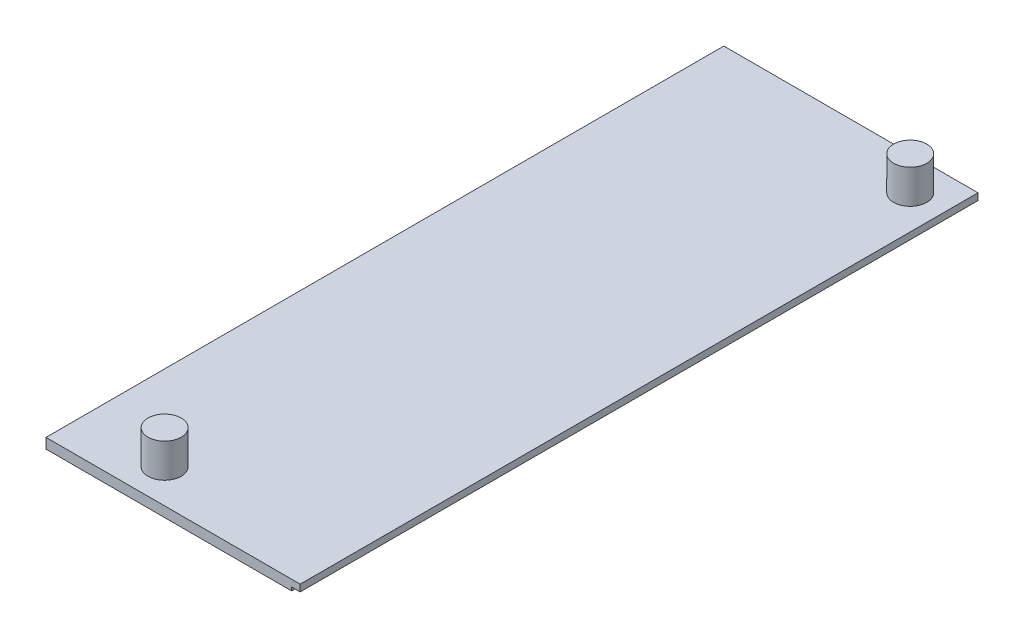
ISO-10303-21;
HEADER;
FILE_DESCRIPTION(('STEP AP214'),'2;1');
FILE_NAME('part.step','',(''),(''),'','','');
FILE_SCHEMA(('AUTOMOTIVE_DESIGN { 1 0 10303 214 1 1 1 1 }'));
ENDSEC;
DATA;
#1=APPLICATION_CONTEXT('core data for automotive mechanical design processes');
#2=APPLICATION_PROTOCOL_DEFINITION('international standard','automotive_design',2000,#1);
#3=PRODUCT_CONTEXT('',#1,'mechanical');
#4=PRODUCT('Part','Part','',(#3));
#5=PRODUCT_RELATED_PRODUCT_CATEGORY('part','',(#4));
#6=PRODUCT_DEFINITION_FORMATION('','',#4);
#7=PRODUCT_DEFINITION_CONTEXT('part definition',#1,'design');
#8=PRODUCT_DEFINITION('design','',#6,#7);
#9=PRODUCT_DEFINITION_SHAPE('','',#8);
#10=(LENGTH_UNIT() NAMED_UNIT(*) SI_UNIT(.MILLI.,.METRE.));
#11=(NAMED_UNIT(*) PLANE_ANGLE_UNIT() SI_UNIT($,.RADIAN.));
#12=(NAMED_UNIT(*) SI_UNIT($,.STERADIAN.) SOLID_ANGLE_UNIT());
#13=UNCERTAINTY_MEASURE_WITH_UNIT(LENGTH_MEASURE(1.E-05),#10,'distance_accuracy_value','');
#14=(GEOMETRIC_REPRESENTATION_CONTEXT(3) GLOBAL_UNCERTAINTY_ASSIGNED_CONTEXT((#13)) GLOBAL_UNIT_ASSIGNED_CONTEXT((#10,
#11,#12)) REPRESENTATION_CONTEXT('',''));
#15=CARTESIAN_POINT('',(0.,0.,0.));
#16=DIRECTION('',(0.,0.,1.));
#17=DIRECTION('',(1.,0.,0.));
#18=AXIS2_PLACEMENT_3D('',#15,#16,#17);
#19=CARTESIAN_POINT('',(75.,0.,200.));
#20=DIRECTION('',(-1.,0.,0.));
#21=DIRECTION('',(0.,0.,1.));
#22=AXIS2_PLACEMENT_3D('',#19,#20,#21);
#23=PLANE('',#22);
#24=DIRECTION('',(0.,0.,1.));
#25=VECTOR('',#24,1.);
#26=CARTESIAN_POINT('',(75.,1.,0.));
#27=LINE('',#26,#25);
#28=CARTESIAN_POINT('',(75.,1.,0.));
#29=VERTEX_POINT('',#28);
#30=CARTESIAN_POINT('',(75.,1.,200.));
#31=VERTEX_POINT('',#30);
#32=EDGE_CURVE('E111',#29,#31,#27,.T.);
#33=ORIENTED_EDGE('',*,*,#32,.F.);
#34=DIRECTION('',(0.,1.,0.));
#35=VECTOR('',#34,1.);
#36=CARTESIAN_POINT('',(75.,0.,0.));
#37=LINE('',#36,#35);
#38=CARTESIAN_POINT('',(75.,3.,0.));
#39=VERTEX_POINT('',#38);
#40=EDGE_CURVE('E140',#29,#39,#37,.T.);
#41=ORIENTED_EDGE('',*,*,#40,.T.);
#42=DIRECTION('',(0.,0.,-1.));
#43=VECTOR('',#42,1.);
#44=CARTESIAN_POINT('',(75.,3.,200.));
#45=LINE('',#44,#43);
#46=CARTESIAN_POINT('',(75.,3.,200.));
#47=VERTEX_POINT('',#46);
#48=EDGE_CURVE('E144',#47,#39,#45,.T.);
#49=ORIENTED_EDGE('',*,*,#48,.F.);
#50=DIRECTION('',(0.,1.,0.));
#51=VECTOR('',#50,1.);
#52=CARTESIAN_POINT('',(75.,0.,200.));
#53=LINE('',#52,#51);
#54=EDGE_CURVE('E131',#31,#47,#53,.T.);
#55=ORIENTED_EDGE('',*,*,#54,.F.);
#56=EDGE_LOOP('',(#33,#41,#49,#55));
#57=FACE_BOUND('',#56,.T.);
#58=ADVANCED_FACE('F37',(#57),#23,.F.);
#59=CARTESIAN_POINT('',(0.,0.,200.));
#60=DIRECTION('',(1.,0.,0.));
#61=DIRECTION('',(0.,0.,-1.));
#62=AXIS2_PLACEMENT_3D('',#59,#60,#61);
#63=PLANE('',#62);
#64=DIRECTION('',(0.,-1.,0.));
#65=VECTOR('',#64,1.);
#66=CARTESIAN_POINT('',(0.,0.,0.));
#67=LINE('',#66,#65);
#68=CARTESIAN_POINT('',(0.,3.,0.));
#69=VERTEX_POINT('',#68);
#70=CARTESIAN_POINT('',(0.,0.,0.));
#71=VERTEX_POINT('',#70);
#72=EDGE_CURVE('E127',#69,#71,#67,.T.);
#73=ORIENTED_EDGE('',*,*,#72,.T.);
#74=DIRECTION('',(0.,0.,-1.));
#75=VECTOR('',#74,1.);
#76=CARTESIAN_POINT('',(0.,0.,200.));
#77=LINE('',#76,#75);
#78=CARTESIAN_POINT('',(0.,0.,200.));
#79=VERTEX_POINT('',#78);
#80=EDGE_CURVE('E146',#79,#71,#77,.T.);
#81=ORIENTED_EDGE('',*,*,#80,.F.);
#82=DIRECTION('',(0.,-1.,0.));
#83=VECTOR('',#82,1.);
#84=CARTESIAN_POINT('',(0.,0.,200.));
#85=LINE('',#84,#83);
#86=CARTESIAN_POINT('',(0.,3.,200.));
#87=VERTEX_POINT('',#86);
#88=EDGE_CURVE('E128',#87,#79,#85,.T.);
#89=ORIENTED_EDGE('',*,*,#88,.F.);
#90=DIRECTION('',(0.,0.,-1.));
#91=VECTOR('',#90,1.);
#92=CARTESIAN_POINT('',(0.,3.,200.));
#93=LINE('',#92,#91);
#94=EDGE_CURVE('E134',#87,#69,#93,.T.);
#95=ORIENTED_EDGE('',*,*,#94,.T.);
#96=EDGE_LOOP('',(#73,#81,#89,#95));
#97=FACE_BOUND('',#96,.T.);
#98=ADVANCED_FACE('F39',(#97),#63,.F.);
#99=CARTESIAN_POINT('',(0.,0.,200.));
#100=DIRECTION('',(0.,1.,0.));
#101=DIRECTION('',(0.,0.,1.));
#102=AXIS2_PLACEMENT_3D('',#99,#100,#101);
#103=PLANE('',#102);
#104=DIRECTION('',(1.,0.,0.));
#105=VECTOR('',#104,1.);
#106=CARTESIAN_POINT('',(0.,0.,0.));
#107=LINE('',#106,#105);
#108=CARTESIAN_POINT('',(72.5,0.,0.));
#109=VERTEX_POINT('',#108);
#110=EDGE_CURVE('E137',#71,#109,#107,.T.);
#111=ORIENTED_EDGE('',*,*,#110,.T.);
#112=DIRECTION('',(0.,0.,-1.));
#113=VECTOR('',#112,1.);
#114=CARTESIAN_POINT('',(72.5,0.,0.));
#115=LINE('',#114,#113);
#116=CARTESIAN_POINT('',(72.5,0.,200.));
#117=VERTEX_POINT('',#116);
#118=EDGE_CURVE('E113',#117,#109,#115,.T.);
#119=ORIENTED_EDGE('',*,*,#118,.F.);
#120=DIRECTION('',(1.,0.,0.));
#121=VECTOR('',#120,1.);
#122=CARTESIAN_POINT('',(0.,0.,200.));
#123=LINE('',#122,#121);
#124=EDGE_CURVE('E85',#79,#117,#123,.T.);
#125=ORIENTED_EDGE('',*,*,#124,.F.);
#126=ORIENTED_EDGE('',*,*,#80,.T.);
#127=EDGE_LOOP('',(#111,#119,#125,#126));
#128=FACE_BOUND('',#127,.T.);
#129=ADVANCED_FACE('F154',(#128),#103,.F.);
#130=CARTESIAN_POINT('',(0.,3.,200.));
#131=DIRECTION('',(0.,-1.,0.));
#132=DIRECTION('',(0.,0.,-1.));
#133=AXIS2_PLACEMENT_3D('',#130,#131,#132);
#134=PLANE('',#133);
#135=CARTESIAN_POINT('',(64.9999999999999,3.,10.));
#136=DIRECTION('',(0.,-1.,0.));
#137=DIRECTION('',(0.,0.,-1.));
#138=AXIS2_PLACEMENT_3D('',#135,#136,#137);
#139=CIRCLE('',#138,4.9);
#140=CARTESIAN_POINT('',(64.9999999999999,3.,5.10000000000001));
#141=VERTEX_POINT('',#140);
#142=EDGE_CURVE('E11',#141,#141,#139,.F.);
#143=ORIENTED_EDGE('',*,*,#142,.F.);
#144=EDGE_LOOP('',(#143));
#145=FACE_BOUND('',#144,.T.);
#146=CARTESIAN_POINT('',(25.,3.,190.));
#147=DIRECTION('',(0.,-1.,0.));
#148=DIRECTION('',(0.,0.,-1.));
#149=AXIS2_PLACEMENT_3D('',#146,#147,#148);
#150=CIRCLE('',#149,4.89999999999999);
#151=CARTESIAN_POINT('',(25.,3.,185.1));
#152=VERTEX_POINT('',#151);
#153=EDGE_CURVE('E45',#152,#152,#150,.F.);
#154=ORIENTED_EDGE('',*,*,#153,.F.);
#155=EDGE_LOOP('',(#154));
#156=FACE_BOUND('',#155,.T.);
#157=DIRECTION('',(-1.,0.,0.));
#158=VECTOR('',#157,1.);
#159=CARTESIAN_POINT('',(0.,3.,0.));
#160=LINE('',#159,#158);
#161=EDGE_CURVE('E78',#39,#69,#160,.T.);
#162=ORIENTED_EDGE('',*,*,#161,.T.);
#163=ORIENTED_EDGE('',*,*,#94,.F.);
#164=DIRECTION('',(-1.,0.,0.));
#165=VECTOR('',#164,1.);
#166=CARTESIAN_POINT('',(0.,3.,200.));
#167=LINE('',#166,#165);
#168=EDGE_CURVE('E61',#47,#87,#167,.T.);
#169=ORIENTED_EDGE('',*,*,#168,.F.);
#170=ORIENTED_EDGE('',*,*,#48,.T.);
#171=EDGE_LOOP('',(#162,#163,#169,#170));
#172=FACE_BOUND('',#171,.T.);
#173=ADVANCED_FACE('F152',(#145,#156,#172),#134,.F.);
#174=CARTESIAN_POINT('',(0.,0.,200.));
#175=DIRECTION('',(0.,0.,-1.));
#176=DIRECTION('',(-1.,0.,0.));
#177=AXIS2_PLACEMENT_3D('',#174,#175,#176);
#178=PLANE('',#177);
#179=ORIENTED_EDGE('',*,*,#124,.T.);
#180=DIRECTION('',(0.,-1.,0.));
#181=VECTOR('',#180,1.);
#182=CARTESIAN_POINT('',(72.5,1.,200.));
#183=LINE('',#182,#181);
#184=CARTESIAN_POINT('',(72.5,1.,200.));
#185=VERTEX_POINT('',#184);
#186=EDGE_CURVE('E101',#185,#117,#183,.T.);
#187=ORIENTED_EDGE('',*,*,#186,.F.);
#188=DIRECTION('',(-1.,0.,0.));
#189=VECTOR('',#188,1.);
#190=CARTESIAN_POINT('',(0.,1.,200.));
#191=LINE('',#190,#189);
#192=EDGE_CURVE('E106',#31,#185,#191,.T.);
#193=ORIENTED_EDGE('',*,*,#192,.F.);
#194=ORIENTED_EDGE('',*,*,#54,.T.);
#195=ORIENTED_EDGE('',*,*,#168,.T.);
#196=ORIENTED_EDGE('',*,*,#88,.T.);
#197=EDGE_LOOP('',(#179,#187,#193,#194,#195,#196));
#198=FACE_BOUND('',#197,.T.);
#199=ADVANCED_FACE('F115',(#198),#178,.F.);
#200=CARTESIAN_POINT('',(0.,0.,0.));
#201=DIRECTION('',(0.,0.,-1.));
#202=DIRECTION('',(-1.,0.,0.));
#203=AXIS2_PLACEMENT_3D('',#200,#201,#202);
#204=PLANE('',#203);
#205=DIRECTION('',(0.,-1.,0.));
#206=VECTOR('',#205,1.);
#207=CARTESIAN_POINT('',(72.5,1.,0.));
#208=LINE('',#207,#206);
#209=CARTESIAN_POINT('',(72.5,1.,0.));
#210=VERTEX_POINT('',#209);
#211=EDGE_CURVE('E103',#210,#109,#208,.T.);
#212=ORIENTED_EDGE('',*,*,#211,.T.);
#213=ORIENTED_EDGE('',*,*,#110,.F.);
#214=ORIENTED_EDGE('',*,*,#72,.F.);
#215=ORIENTED_EDGE('',*,*,#161,.F.);
#216=ORIENTED_EDGE('',*,*,#40,.F.);
#217=DIRECTION('',(1.,0.,0.));
#218=VECTOR('',#217,1.);
#219=CARTESIAN_POINT('',(0.,1.,0.));
#220=LINE('',#219,#218);
#221=EDGE_CURVE('E105',#210,#29,#220,.T.);
#222=ORIENTED_EDGE('',*,*,#221,.F.);
#223=EDGE_LOOP('',(#212,#213,#214,#215,#216,#222));
#224=FACE_BOUND('',#223,.T.);
#225=ADVANCED_FACE('F161',(#224),#204,.T.);
#226=CARTESIAN_POINT('',(25.,13.,190.));
#227=DIRECTION('',(0.,-1.,0.));
#228=DIRECTION('',(0.,0.,-1.));
#229=AXIS2_PLACEMENT_3D('',#226,#227,#228);
#230=CYLINDRICAL_SURFACE('',#229,4.89999999999999);
#231=CARTESIAN_POINT('',(25.,13.,190.));
#232=DIRECTION('',(0.,1.,0.));
#233=DIRECTION('',(0.,0.,1.));
#234=AXIS2_PLACEMENT_3D('',#231,#232,#233);
#235=CIRCLE('',#234,4.89999999999999);
#236=CARTESIAN_POINT('',(25.,13.,194.9));
#237=VERTEX_POINT('',#236);
#238=EDGE_CURVE('E124',#237,#237,#235,.T.);
#239=ORIENTED_EDGE('',*,*,#238,.F.);
#240=EDGE_LOOP('',(#239));
#241=FACE_BOUND('',#240,.T.);
#242=ORIENTED_EDGE('',*,*,#153,.T.);
#243=EDGE_LOOP('',(#242));
#244=FACE_BOUND('',#243,.T.);
#245=ADVANCED_FACE('F150',(#241,#244),#230,.T.);
#246=CARTESIAN_POINT('',(0.,13.,0.));
#247=DIRECTION('',(0.,1.,0.));
#248=DIRECTION('',(0.,0.,1.));
#249=AXIS2_PLACEMENT_3D('',#246,#247,#248);
#250=PLANE('',#249);
#251=ORIENTED_EDGE('',*,*,#238,.T.);
#252=EDGE_LOOP('',(#251));
#253=FACE_BOUND('',#252,.T.);
#254=ADVANCED_FACE('F183',(#253),#250,.T.);
#255=CARTESIAN_POINT('',(64.9999999999999,13.,10.));
#256=DIRECTION('',(0.,-1.,0.));
#257=DIRECTION('',(0.,0.,-1.));
#258=AXIS2_PLACEMENT_3D('',#255,#256,#257);
#259=CYLINDRICAL_SURFACE('',#258,4.9);
#260=CARTESIAN_POINT('',(64.9999999999999,13.,10.));
#261=DIRECTION('',(0.,1.,0.));
#262=DIRECTION('',(0.,0.,1.));
#263=AXIS2_PLACEMENT_3D('',#260,#261,#262);
#264=CIRCLE('',#263,4.9);
#265=CARTESIAN_POINT('',(64.9999999999999,13.,14.9));
#266=VERTEX_POINT('',#265);
#267=EDGE_CURVE('E117',#266,#266,#264,.T.);
#268=ORIENTED_EDGE('',*,*,#267,.F.);
#269=EDGE_LOOP('',(#268));
#270=FACE_BOUND('',#269,.T.);
#271=ORIENTED_EDGE('',*,*,#142,.T.);
#272=EDGE_LOOP('',(#271));
#273=FACE_BOUND('',#272,.T.);
#274=ADVANCED_FACE('F189',(#270,#273),#259,.T.);
#275=CARTESIAN_POINT('',(0.,13.,0.));
#276=DIRECTION('',(0.,1.,0.));
#277=DIRECTION('',(0.,0.,1.));
#278=AXIS2_PLACEMENT_3D('',#275,#276,#277);
#279=PLANE('',#278);
#280=ORIENTED_EDGE('',*,*,#267,.T.);
#281=EDGE_LOOP('',(#280));
#282=FACE_BOUND('',#281,.T.);
#283=ADVANCED_FACE('F193',(#282),#279,.T.);
#284=CARTESIAN_POINT('',(72.5,1.,0.));
#285=DIRECTION('',(-1.,0.,0.));
#286=DIRECTION('',(0.,0.,1.));
#287=AXIS2_PLACEMENT_3D('',#284,#285,#286);
#288=PLANE('',#287);
#289=ORIENTED_EDGE('',*,*,#118,.T.);
#290=ORIENTED_EDGE('',*,*,#211,.F.);
#291=DIRECTION('',(0.,0.,-1.));
#292=VECTOR('',#291,1.);
#293=CARTESIAN_POINT('',(72.5,1.,0.));
#294=LINE('',#293,#292);
#295=EDGE_CURVE('E52',#185,#210,#294,.T.);
#296=ORIENTED_EDGE('',*,*,#295,.F.);
#297=ORIENTED_EDGE('',*,*,#186,.T.);
#298=EDGE_LOOP('',(#289,#290,#296,#297));
#299=FACE_BOUND('',#298,.T.);
#300=ADVANCED_FACE('F99',(#299),#288,.F.);
#301=CARTESIAN_POINT('',(0.,1.,0.));
#302=DIRECTION('',(0.,-1.,0.));
#303=DIRECTION('',(0.,0.,-1.));
#304=AXIS2_PLACEMENT_3D('',#301,#302,#303);
#305=PLANE('',#304);
#306=ORIENTED_EDGE('',*,*,#192,.T.);
#307=ORIENTED_EDGE('',*,*,#295,.T.);
#308=ORIENTED_EDGE('',*,*,#221,.T.);
#309=ORIENTED_EDGE('',*,*,#32,.T.);
#310=EDGE_LOOP('',(#306,#307,#308,#309));
#311=FACE_BOUND('',#310,.T.);
#312=ADVANCED_FACE('F109',(#311),#305,.T.);
#313=CLOSED_SHELL('',(#58,#98,#129,#173,#199,#225,#245,#254,#274,#283,#300,#312));
#314=MANIFOLD_SOLID_BREP('B2',#313);
#315=ADVANCED_BREP_SHAPE_REPRESENTATION('',(#18,#314),#14);
#316=SHAPE_DEFINITION_REPRESENTATION(#9,#315);
ENDSEC;
END-ISO-10303-21;
